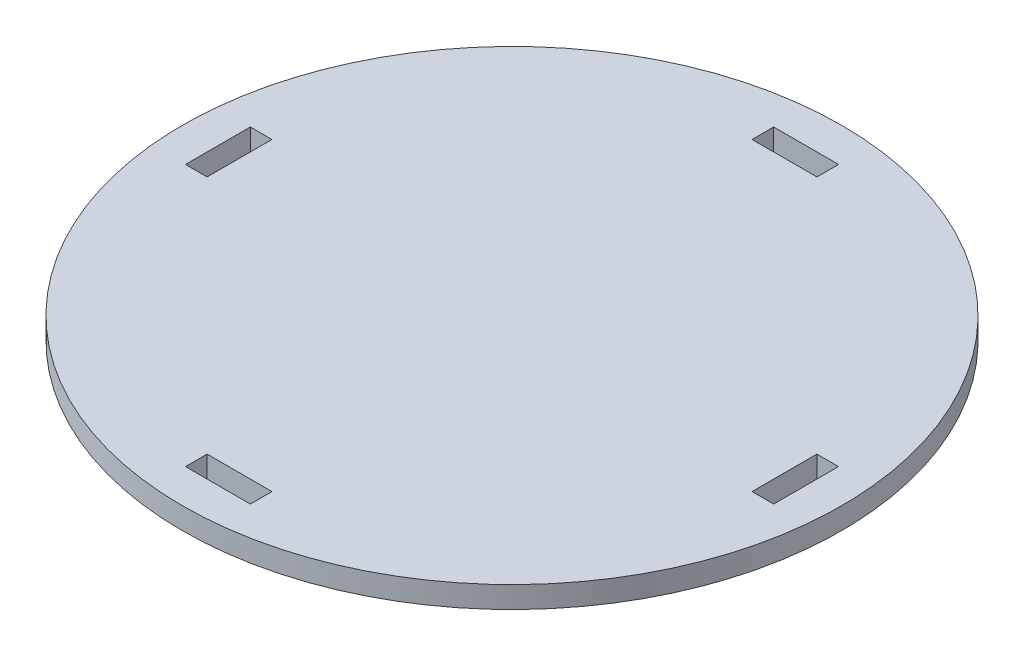
ISO-10303-21;
HEADER;
FILE_DESCRIPTION(('STEP AP214'),'2;1');
FILE_NAME('part.step','',(''),(''),'','','');
FILE_SCHEMA(('AUTOMOTIVE_DESIGN { 1 0 10303 214 1 1 1 1 }'));
ENDSEC;
DATA;
#1=APPLICATION_CONTEXT('core data for automotive mechanical design processes');
#2=APPLICATION_PROTOCOL_DEFINITION('international standard','automotive_design',2000,#1);
#3=PRODUCT_CONTEXT('',#1,'mechanical');
#4=PRODUCT('Part','Part','',(#3));
#5=PRODUCT_RELATED_PRODUCT_CATEGORY('part','',(#4));
#6=PRODUCT_DEFINITION_FORMATION('','',#4);
#7=PRODUCT_DEFINITION_CONTEXT('part definition',#1,'design');
#8=PRODUCT_DEFINITION('design','',#6,#7);
#9=PRODUCT_DEFINITION_SHAPE('','',#8);
#10=(LENGTH_UNIT() NAMED_UNIT(*) SI_UNIT(.MILLI.,.METRE.));
#11=(NAMED_UNIT(*) PLANE_ANGLE_UNIT() SI_UNIT($,.RADIAN.));
#12=(NAMED_UNIT(*) SI_UNIT($,.STERADIAN.) SOLID_ANGLE_UNIT());
#13=UNCERTAINTY_MEASURE_WITH_UNIT(LENGTH_MEASURE(1.E-05),#10,'distance_accuracy_value','');
#14=(GEOMETRIC_REPRESENTATION_CONTEXT(3) GLOBAL_UNCERTAINTY_ASSIGNED_CONTEXT((#13)) GLOBAL_UNIT_ASSIGNED_CONTEXT((#10,
#11,#12)) REPRESENTATION_CONTEXT('',''));
#15=CARTESIAN_POINT('',(0.,0.,0.));
#16=DIRECTION('',(0.,0.,1.));
#17=DIRECTION('',(1.,0.,0.));
#18=AXIS2_PLACEMENT_3D('',#15,#16,#17);
#19=CARTESIAN_POINT('',(0.,5.,0.));
#20=DIRECTION('',(0.,1.,0.));
#21=DIRECTION('',(0.,0.,1.));
#22=AXIS2_PLACEMENT_3D('',#19,#20,#21);
#23=PLANE('',#22);
#24=CARTESIAN_POINT('',(0.,5.,0.));
#25=DIRECTION('',(0.,1.,0.));
#26=DIRECTION('',(0.,0.,1.));
#27=AXIS2_PLACEMENT_3D('',#24,#25,#26);
#28=CIRCLE('',#27,76.2);
#29=CARTESIAN_POINT('',(0.,5.,76.2));
#30=VERTEX_POINT('',#29);
#31=EDGE_CURVE('E11',#30,#30,#28,.T.);
#32=ORIENTED_EDGE('',*,*,#31,.T.);
#33=EDGE_LOOP('',(#32));
#34=FACE_BOUND('',#33,.T.);
#35=DIRECTION('',(-1.,0.,0.));
#36=VECTOR('',#35,1.);
#37=CARTESIAN_POINT('',(-63.,5.,-7.5));
#38=LINE('',#37,#36);
#39=CARTESIAN_POINT('',(-63.,5.,-7.5));
#40=VERTEX_POINT('',#39);
#41=CARTESIAN_POINT('',(-68.,5.,-7.50000000000001));
#42=VERTEX_POINT('',#41);
#43=EDGE_CURVE('E294',#40,#42,#38,.T.);
#44=ORIENTED_EDGE('',*,*,#43,.F.);
#45=DIRECTION('',(0.,0.,-1.));
#46=VECTOR('',#45,1.);
#47=CARTESIAN_POINT('',(-63.,5.,-7.5));
#48=LINE('',#47,#46);
#49=CARTESIAN_POINT('',(-63.,5.,7.5));
#50=VERTEX_POINT('',#49);
#51=EDGE_CURVE('E291',#50,#40,#48,.T.);
#52=ORIENTED_EDGE('',*,*,#51,.F.);
#53=DIRECTION('',(1.,0.,0.));
#54=VECTOR('',#53,1.);
#55=CARTESIAN_POINT('',(-63.,5.,7.5));
#56=LINE('',#55,#54);
#57=CARTESIAN_POINT('',(-68.,5.,7.49999999999999));
#58=VERTEX_POINT('',#57);
#59=EDGE_CURVE('E302',#58,#50,#56,.T.);
#60=ORIENTED_EDGE('',*,*,#59,.F.);
#61=DIRECTION('',(0.,0.,1.));
#62=VECTOR('',#61,1.);
#63=CARTESIAN_POINT('',(-68.,5.,-7.50000000000001));
#64=LINE('',#63,#62);
#65=EDGE_CURVE('E298',#42,#58,#64,.T.);
#66=ORIENTED_EDGE('',*,*,#65,.F.);
#67=EDGE_LOOP('',(#44,#52,#60,#66));
#68=FACE_BOUND('',#67,.T.);
#69=DIRECTION('',(0.,0.,-1.));
#70=VECTOR('',#69,1.);
#71=CARTESIAN_POINT('',(7.49999999999193,5.,-63.0000000000103));
#72=LINE('',#71,#70);
#73=CARTESIAN_POINT('',(7.49999999999193,5.,-63.0000000000103));
#74=VERTEX_POINT('',#73);
#75=CARTESIAN_POINT('',(7.49999999999193,5.,-68.0000000000103));
#76=VERTEX_POINT('',#75);
#77=EDGE_CURVE('E251',#74,#76,#72,.T.);
#78=ORIENTED_EDGE('',*,*,#77,.F.);
#79=DIRECTION('',(1.,0.,0.));
#80=VECTOR('',#79,1.);
#81=CARTESIAN_POINT('',(7.49999999999193,5.,-63.0000000000103));
#82=LINE('',#81,#80);
#83=CARTESIAN_POINT('',(-7.50000000000807,5.,-63.0000000000103));
#84=VERTEX_POINT('',#83);
#85=EDGE_CURVE('E248',#84,#74,#82,.T.);
#86=ORIENTED_EDGE('',*,*,#85,.F.);
#87=DIRECTION('',(0.,0.,1.));
#88=VECTOR('',#87,1.);
#89=CARTESIAN_POINT('',(-7.50000000000807,5.,-63.0000000000103));
#90=LINE('',#89,#88);
#91=CARTESIAN_POINT('',(-7.50000000000807,5.,-68.0000000000103));
#92=VERTEX_POINT('',#91);
#93=EDGE_CURVE('E259',#92,#84,#90,.T.);
#94=ORIENTED_EDGE('',*,*,#93,.F.);
#95=DIRECTION('',(-1.,0.,0.));
#96=VECTOR('',#95,1.);
#97=CARTESIAN_POINT('',(7.49999999999193,5.,-68.0000000000103));
#98=LINE('',#97,#96);
#99=EDGE_CURVE('E255',#76,#92,#98,.T.);
#100=ORIENTED_EDGE('',*,*,#99,.F.);
#101=EDGE_LOOP('',(#78,#86,#94,#100));
#102=FACE_BOUND('',#101,.T.);
#103=DIRECTION('',(1.,0.,0.));
#104=VECTOR('',#103,1.);
#105=CARTESIAN_POINT('',(63.0000000000023,5.,7.49999999998161));
#106=LINE('',#105,#104);
#107=CARTESIAN_POINT('',(63.0000000000023,5.,7.49999999998161));
#108=VERTEX_POINT('',#107);
#109=CARTESIAN_POINT('',(68.0000000000023,5.,7.49999999998161));
#110=VERTEX_POINT('',#109);
#111=EDGE_CURVE('E208',#108,#110,#106,.T.);
#112=ORIENTED_EDGE('',*,*,#111,.F.);
#113=DIRECTION('',(0.,0.,1.));
#114=VECTOR('',#113,1.);
#115=CARTESIAN_POINT('',(63.0000000000023,5.,7.49999999998161));
#116=LINE('',#115,#114);
#117=CARTESIAN_POINT('',(63.0000000000023,5.,-7.50000000001839));
#118=VERTEX_POINT('',#117);
#119=EDGE_CURVE('E205',#118,#108,#116,.T.);
#120=ORIENTED_EDGE('',*,*,#119,.F.);
#121=DIRECTION('',(-1.,0.,0.));
#122=VECTOR('',#121,1.);
#123=CARTESIAN_POINT('',(63.0000000000023,5.,-7.50000000001839));
#124=LINE('',#123,#122);
#125=CARTESIAN_POINT('',(68.0000000000023,5.,-7.50000000001839));
#126=VERTEX_POINT('',#125);
#127=EDGE_CURVE('E216',#126,#118,#124,.T.);
#128=ORIENTED_EDGE('',*,*,#127,.F.);
#129=DIRECTION('',(0.,0.,-1.));
#130=VECTOR('',#129,1.);
#131=CARTESIAN_POINT('',(68.0000000000023,5.,7.49999999998161));
#132=LINE('',#131,#130);
#133=EDGE_CURVE('E212',#110,#126,#132,.T.);
#134=ORIENTED_EDGE('',*,*,#133,.F.);
#135=EDGE_LOOP('',(#112,#120,#128,#134));
#136=FACE_BOUND('',#135,.T.);
#137=DIRECTION('',(0.,0.,1.));
#138=VECTOR('',#137,1.);
#139=CARTESIAN_POINT('',(-7.49999999998967,5.,62.9999999999919));
#140=LINE('',#139,#138);
#141=CARTESIAN_POINT('',(-7.49999999998967,5.,62.9999999999919));
#142=VERTEX_POINT('',#141);
#143=CARTESIAN_POINT('',(-7.49999999998968,5.,67.999999999992));
#144=VERTEX_POINT('',#143);
#145=EDGE_CURVE('E166',#142,#144,#140,.T.);
#146=ORIENTED_EDGE('',*,*,#145,.F.);
#147=DIRECTION('',(-1.,0.,0.));
#148=VECTOR('',#147,1.);
#149=CARTESIAN_POINT('',(-7.49999999998967,5.,62.9999999999919));
#150=LINE('',#149,#148);
#151=CARTESIAN_POINT('',(7.50000000001033,5.,62.9999999999919));
#152=VERTEX_POINT('',#151);
#153=EDGE_CURVE('E157',#152,#142,#150,.T.);
#154=ORIENTED_EDGE('',*,*,#153,.F.);
#155=DIRECTION('',(0.,0.,-1.));
#156=VECTOR('',#155,1.);
#157=CARTESIAN_POINT('',(7.50000000001033,5.,62.9999999999919));
#158=LINE('',#157,#156);
#159=CARTESIAN_POINT('',(7.50000000001032,5.,67.999999999992));
#160=VERTEX_POINT('',#159);
#161=EDGE_CURVE('E183',#160,#152,#158,.T.);
#162=ORIENTED_EDGE('',*,*,#161,.F.);
#163=DIRECTION('',(1.,0.,0.));
#164=VECTOR('',#163,1.);
#165=CARTESIAN_POINT('',(-7.49999999998968,5.,67.999999999992));
#166=LINE('',#165,#164);
#167=EDGE_CURVE('E179',#144,#160,#166,.T.);
#168=ORIENTED_EDGE('',*,*,#167,.F.);
#169=EDGE_LOOP('',(#146,#154,#162,#168));
#170=FACE_BOUND('',#169,.T.);
#171=ADVANCED_FACE('F43',(#34,#68,#102,#136,#170),#23,.T.);
#172=CARTESIAN_POINT('',(0.,0.,0.));
#173=DIRECTION('',(0.,1.,0.));
#174=DIRECTION('',(0.,0.,1.));
#175=AXIS2_PLACEMENT_3D('',#172,#173,#174);
#176=PLANE('',#175);
#177=DIRECTION('',(0.,0.,1.));
#178=VECTOR('',#177,1.);
#179=CARTESIAN_POINT('',(63.0000000000023,0.,7.49999999998161));
#180=LINE('',#179,#178);
#181=CARTESIAN_POINT('',(63.0000000000023,0.,-7.50000000001839));
#182=VERTEX_POINT('',#181);
#183=CARTESIAN_POINT('',(63.0000000000023,0.,7.49999999998161));
#184=VERTEX_POINT('',#183);
#185=EDGE_CURVE('E175',#182,#184,#180,.T.);
#186=ORIENTED_EDGE('',*,*,#185,.T.);
#187=DIRECTION('',(1.,0.,0.));
#188=VECTOR('',#187,1.);
#189=CARTESIAN_POINT('',(63.0000000000023,0.,7.49999999998161));
#190=LINE('',#189,#188);
#191=CARTESIAN_POINT('',(68.0000000000023,0.,7.49999999998161));
#192=VERTEX_POINT('',#191);
#193=EDGE_CURVE('E223',#184,#192,#190,.T.);
#194=ORIENTED_EDGE('',*,*,#193,.T.);
#195=DIRECTION('',(0.,0.,-1.));
#196=VECTOR('',#195,1.);
#197=CARTESIAN_POINT('',(68.0000000000023,0.,7.49999999998161));
#198=LINE('',#197,#196);
#199=CARTESIAN_POINT('',(68.0000000000023,0.,-7.50000000001839));
#200=VERTEX_POINT('',#199);
#201=EDGE_CURVE('E227',#192,#200,#198,.T.);
#202=ORIENTED_EDGE('',*,*,#201,.T.);
#203=DIRECTION('',(-1.,0.,0.));
#204=VECTOR('',#203,1.);
#205=CARTESIAN_POINT('',(63.0000000000023,0.,-7.50000000001839));
#206=LINE('',#205,#204);
#207=EDGE_CURVE('E209',#200,#182,#206,.T.);
#208=ORIENTED_EDGE('',*,*,#207,.T.);
#209=EDGE_LOOP('',(#186,#194,#202,#208));
#210=FACE_BOUND('',#209,.T.);
#211=DIRECTION('',(0.,0.,-1.));
#212=VECTOR('',#211,1.);
#213=CARTESIAN_POINT('',(-63.,0.,-7.5));
#214=LINE('',#213,#212);
#215=CARTESIAN_POINT('',(-63.,0.,7.5));
#216=VERTEX_POINT('',#215);
#217=CARTESIAN_POINT('',(-63.,0.,-7.5));
#218=VERTEX_POINT('',#217);
#219=EDGE_CURVE('E290',#216,#218,#214,.T.);
#220=ORIENTED_EDGE('',*,*,#219,.T.);
#221=DIRECTION('',(-1.,0.,0.));
#222=VECTOR('',#221,1.);
#223=CARTESIAN_POINT('',(-63.,0.,-7.5));
#224=LINE('',#223,#222);
#225=CARTESIAN_POINT('',(-68.,0.,-7.50000000000001));
#226=VERTEX_POINT('',#225);
#227=EDGE_CURVE('E309',#218,#226,#224,.T.);
#228=ORIENTED_EDGE('',*,*,#227,.T.);
#229=DIRECTION('',(0.,0.,1.));
#230=VECTOR('',#229,1.);
#231=CARTESIAN_POINT('',(-68.,0.,-7.50000000000001));
#232=LINE('',#231,#230);
#233=CARTESIAN_POINT('',(-68.,0.,7.49999999999999));
#234=VERTEX_POINT('',#233);
#235=EDGE_CURVE('E313',#226,#234,#232,.T.);
#236=ORIENTED_EDGE('',*,*,#235,.T.);
#237=DIRECTION('',(1.,0.,0.));
#238=VECTOR('',#237,1.);
#239=CARTESIAN_POINT('',(-63.,0.,7.5));
#240=LINE('',#239,#238);
#241=EDGE_CURVE('E295',#234,#216,#240,.T.);
#242=ORIENTED_EDGE('',*,*,#241,.T.);
#243=EDGE_LOOP('',(#220,#228,#236,#242));
#244=FACE_BOUND('',#243,.T.);
#245=CARTESIAN_POINT('',(0.,0.,0.));
#246=DIRECTION('',(0.,1.,0.));
#247=DIRECTION('',(0.,0.,1.));
#248=AXIS2_PLACEMENT_3D('',#245,#246,#247);
#249=CIRCLE('',#248,76.2);
#250=CARTESIAN_POINT('',(0.,0.,76.2));
#251=VERTEX_POINT('',#250);
#252=EDGE_CURVE('E47',#251,#251,#249,.T.);
#253=ORIENTED_EDGE('',*,*,#252,.F.);
#254=EDGE_LOOP('',(#253));
#255=FACE_BOUND('',#254,.T.);
#256=DIRECTION('',(1.,0.,0.));
#257=VECTOR('',#256,1.);
#258=CARTESIAN_POINT('',(7.49999999999193,0.,-63.0000000000103));
#259=LINE('',#258,#257);
#260=CARTESIAN_POINT('',(-7.50000000000807,0.,-63.0000000000103));
#261=VERTEX_POINT('',#260);
#262=CARTESIAN_POINT('',(7.49999999999193,0.,-63.0000000000103));
#263=VERTEX_POINT('',#262);
#264=EDGE_CURVE('E247',#261,#263,#259,.T.);
#265=ORIENTED_EDGE('',*,*,#264,.T.);
#266=DIRECTION('',(0.,0.,-1.));
#267=VECTOR('',#266,1.);
#268=CARTESIAN_POINT('',(7.49999999999193,0.,-63.0000000000103));
#269=LINE('',#268,#267);
#270=CARTESIAN_POINT('',(7.49999999999193,0.,-68.0000000000103));
#271=VERTEX_POINT('',#270);
#272=EDGE_CURVE('E266',#263,#271,#269,.T.);
#273=ORIENTED_EDGE('',*,*,#272,.T.);
#274=DIRECTION('',(-1.,0.,0.));
#275=VECTOR('',#274,1.);
#276=CARTESIAN_POINT('',(7.49999999999193,0.,-68.0000000000103));
#277=LINE('',#276,#275);
#278=CARTESIAN_POINT('',(-7.50000000000807,0.,-68.0000000000103));
#279=VERTEX_POINT('',#278);
#280=EDGE_CURVE('E270',#271,#279,#277,.T.);
#281=ORIENTED_EDGE('',*,*,#280,.T.);
#282=DIRECTION('',(0.,0.,1.));
#283=VECTOR('',#282,1.);
#284=CARTESIAN_POINT('',(-7.50000000000807,0.,-63.0000000000103));
#285=LINE('',#284,#283);
#286=EDGE_CURVE('E252',#279,#261,#285,.T.);
#287=ORIENTED_EDGE('',*,*,#286,.T.);
#288=EDGE_LOOP('',(#265,#273,#281,#287));
#289=FACE_BOUND('',#288,.T.);
#290=DIRECTION('',(-1.,0.,0.));
#291=VECTOR('',#290,1.);
#292=CARTESIAN_POINT('',(-7.49999999998967,0.,62.9999999999919));
#293=LINE('',#292,#291);
#294=CARTESIAN_POINT('',(7.50000000001033,0.,62.9999999999919));
#295=VERTEX_POINT('',#294);
#296=CARTESIAN_POINT('',(-7.49999999998967,0.,62.9999999999919));
#297=VERTEX_POINT('',#296);
#298=EDGE_CURVE('E67',#295,#297,#293,.T.);
#299=ORIENTED_EDGE('',*,*,#298,.T.);
#300=DIRECTION('',(0.,0.,1.));
#301=VECTOR('',#300,1.);
#302=CARTESIAN_POINT('',(-7.49999999998967,0.,62.9999999999919));
#303=LINE('',#302,#301);
#304=CARTESIAN_POINT('',(-7.49999999998968,0.,67.999999999992));
#305=VERTEX_POINT('',#304);
#306=EDGE_CURVE('E173',#297,#305,#303,.T.);
#307=ORIENTED_EDGE('',*,*,#306,.T.);
#308=DIRECTION('',(1.,0.,0.));
#309=VECTOR('',#308,1.);
#310=CARTESIAN_POINT('',(-7.49999999998968,0.,67.999999999992));
#311=LINE('',#310,#309);
#312=CARTESIAN_POINT('',(7.50000000001032,0.,67.999999999992));
#313=VERTEX_POINT('',#312);
#314=EDGE_CURVE('E192',#305,#313,#311,.T.);
#315=ORIENTED_EDGE('',*,*,#314,.T.);
#316=DIRECTION('',(0.,0.,-1.));
#317=VECTOR('',#316,1.);
#318=CARTESIAN_POINT('',(7.50000000001033,0.,62.9999999999919));
#319=LINE('',#318,#317);
#320=EDGE_CURVE('E167',#313,#295,#319,.T.);
#321=ORIENTED_EDGE('',*,*,#320,.T.);
#322=EDGE_LOOP('',(#299,#307,#315,#321));
#323=FACE_BOUND('',#322,.T.);
#324=ADVANCED_FACE('F339',(#210,#244,#255,#289,#323),#176,.F.);
#325=CARTESIAN_POINT('',(0.,5.,0.));
#326=DIRECTION('',(0.,-1.,0.));
#327=DIRECTION('',(0.,0.,-1.));
#328=AXIS2_PLACEMENT_3D('',#325,#326,#327);
#329=CYLINDRICAL_SURFACE('',#328,76.2);
#330=ORIENTED_EDGE('',*,*,#31,.F.);
#331=EDGE_LOOP('',(#330));
#332=FACE_BOUND('',#331,.T.);
#333=ORIENTED_EDGE('',*,*,#252,.T.);
#334=EDGE_LOOP('',(#333));
#335=FACE_BOUND('',#334,.T.);
#336=ADVANCED_FACE('F45',(#332,#335),#329,.T.);
#337=CARTESIAN_POINT('',(-63.,5.,-7.5));
#338=DIRECTION('',(-1.,0.,0.));
#339=DIRECTION('',(0.,0.,1.));
#340=AXIS2_PLACEMENT_3D('',#337,#338,#339);
#341=PLANE('',#340);
#342=ORIENTED_EDGE('',*,*,#219,.F.);
#343=DIRECTION('',(0.,-1.,0.));
#344=VECTOR('',#343,1.);
#345=CARTESIAN_POINT('',(-63.,5.,7.5));
#346=LINE('',#345,#344);
#347=EDGE_CURVE('E305',#50,#216,#346,.T.);
#348=ORIENTED_EDGE('',*,*,#347,.F.);
#349=ORIENTED_EDGE('',*,*,#51,.T.);
#350=DIRECTION('',(0.,-1.,0.));
#351=VECTOR('',#350,1.);
#352=CARTESIAN_POINT('',(-63.,5.,-7.5));
#353=LINE('',#352,#351);
#354=EDGE_CURVE('E329',#40,#218,#353,.T.);
#355=ORIENTED_EDGE('',*,*,#354,.T.);
#356=EDGE_LOOP('',(#342,#348,#349,#355));
#357=FACE_BOUND('',#356,.T.);
#358=ADVANCED_FACE('F361',(#357),#341,.T.);
#359=CARTESIAN_POINT('',(-63.,5.,-7.5));
#360=DIRECTION('',(0.,0.,1.));
#361=DIRECTION('',(1.,0.,0.));
#362=AXIS2_PLACEMENT_3D('',#359,#360,#361);
#363=PLANE('',#362);
#364=ORIENTED_EDGE('',*,*,#227,.F.);
#365=ORIENTED_EDGE('',*,*,#354,.F.);
#366=ORIENTED_EDGE('',*,*,#43,.T.);
#367=DIRECTION('',(0.,-1.,0.));
#368=VECTOR('',#367,1.);
#369=CARTESIAN_POINT('',(-68.,5.,-7.50000000000001));
#370=LINE('',#369,#368);
#371=EDGE_CURVE('E326',#42,#226,#370,.T.);
#372=ORIENTED_EDGE('',*,*,#371,.T.);
#373=EDGE_LOOP('',(#364,#365,#366,#372));
#374=FACE_BOUND('',#373,.T.);
#375=ADVANCED_FACE('F364',(#374),#363,.T.);
#376=CARTESIAN_POINT('',(-68.,5.,-7.50000000000001));
#377=DIRECTION('',(1.,0.,0.));
#378=DIRECTION('',(0.,0.,-1.));
#379=AXIS2_PLACEMENT_3D('',#376,#377,#378);
#380=PLANE('',#379);
#381=ORIENTED_EDGE('',*,*,#235,.F.);
#382=ORIENTED_EDGE('',*,*,#371,.F.);
#383=ORIENTED_EDGE('',*,*,#65,.T.);
#384=DIRECTION('',(0.,-1.,0.));
#385=VECTOR('',#384,1.);
#386=CARTESIAN_POINT('',(-68.,5.,7.49999999999999));
#387=LINE('',#386,#385);
#388=EDGE_CURVE('E323',#58,#234,#387,.T.);
#389=ORIENTED_EDGE('',*,*,#388,.T.);
#390=EDGE_LOOP('',(#381,#382,#383,#389));
#391=FACE_BOUND('',#390,.T.);
#392=ADVANCED_FACE('F367',(#391),#380,.T.);
#393=CARTESIAN_POINT('',(-63.,5.,7.5));
#394=DIRECTION('',(0.,0.,-1.));
#395=DIRECTION('',(-1.,0.,0.));
#396=AXIS2_PLACEMENT_3D('',#393,#394,#395);
#397=PLANE('',#396);
#398=ORIENTED_EDGE('',*,*,#241,.F.);
#399=ORIENTED_EDGE('',*,*,#388,.F.);
#400=ORIENTED_EDGE('',*,*,#59,.T.);
#401=ORIENTED_EDGE('',*,*,#347,.T.);
#402=EDGE_LOOP('',(#398,#399,#400,#401));
#403=FACE_BOUND('',#402,.T.);
#404=ADVANCED_FACE('F371',(#403),#397,.T.);
#405=CARTESIAN_POINT('',(7.49999999999193,5.,-63.0000000000103));
#406=DIRECTION('',(0.,0.,-1.));
#407=DIRECTION('',(-1.,0.,0.));
#408=AXIS2_PLACEMENT_3D('',#405,#406,#407);
#409=PLANE('',#408);
#410=ORIENTED_EDGE('',*,*,#264,.F.);
#411=DIRECTION('',(0.,-1.,0.));
#412=VECTOR('',#411,1.);
#413=CARTESIAN_POINT('',(-7.50000000000807,5.,-63.0000000000103));
#414=LINE('',#413,#412);
#415=EDGE_CURVE('E262',#84,#261,#414,.T.);
#416=ORIENTED_EDGE('',*,*,#415,.F.);
#417=ORIENTED_EDGE('',*,*,#85,.T.);
#418=DIRECTION('',(0.,-1.,0.));
#419=VECTOR('',#418,1.);
#420=CARTESIAN_POINT('',(7.49999999999193,5.,-63.0000000000103));
#421=LINE('',#420,#419);
#422=EDGE_CURVE('E286',#74,#263,#421,.T.);
#423=ORIENTED_EDGE('',*,*,#422,.T.);
#424=EDGE_LOOP('',(#410,#416,#417,#423));
#425=FACE_BOUND('',#424,.T.);
#426=ADVANCED_FACE('F375',(#425),#409,.T.);
#427=CARTESIAN_POINT('',(7.49999999999193,5.,-63.0000000000103));
#428=DIRECTION('',(-1.,0.,0.));
#429=DIRECTION('',(0.,0.,1.));
#430=AXIS2_PLACEMENT_3D('',#427,#428,#429);
#431=PLANE('',#430);
#432=ORIENTED_EDGE('',*,*,#272,.F.);
#433=ORIENTED_EDGE('',*,*,#422,.F.);
#434=ORIENTED_EDGE('',*,*,#77,.T.);
#435=DIRECTION('',(0.,-1.,0.));
#436=VECTOR('',#435,1.);
#437=CARTESIAN_POINT('',(7.49999999999193,5.,-68.0000000000103));
#438=LINE('',#437,#436);
#439=EDGE_CURVE('E283',#76,#271,#438,.T.);
#440=ORIENTED_EDGE('',*,*,#439,.T.);
#441=EDGE_LOOP('',(#432,#433,#434,#440));
#442=FACE_BOUND('',#441,.T.);
#443=ADVANCED_FACE('F379',(#442),#431,.T.);
#444=CARTESIAN_POINT('',(7.49999999999193,5.,-68.0000000000103));
#445=DIRECTION('',(0.,0.,1.));
#446=DIRECTION('',(1.,0.,0.));
#447=AXIS2_PLACEMENT_3D('',#444,#445,#446);
#448=PLANE('',#447);
#449=ORIENTED_EDGE('',*,*,#280,.F.);
#450=ORIENTED_EDGE('',*,*,#439,.F.);
#451=ORIENTED_EDGE('',*,*,#99,.T.);
#452=DIRECTION('',(0.,-1.,0.));
#453=VECTOR('',#452,1.);
#454=CARTESIAN_POINT('',(-7.50000000000807,5.,-68.0000000000103));
#455=LINE('',#454,#453);
#456=EDGE_CURVE('E280',#92,#279,#455,.T.);
#457=ORIENTED_EDGE('',*,*,#456,.T.);
#458=EDGE_LOOP('',(#449,#450,#451,#457));
#459=FACE_BOUND('',#458,.T.);
#460=ADVANCED_FACE('F383',(#459),#448,.T.);
#461=CARTESIAN_POINT('',(-7.50000000000807,5.,-63.0000000000103));
#462=DIRECTION('',(1.,0.,0.));
#463=DIRECTION('',(0.,0.,-1.));
#464=AXIS2_PLACEMENT_3D('',#461,#462,#463);
#465=PLANE('',#464);
#466=ORIENTED_EDGE('',*,*,#286,.F.);
#467=ORIENTED_EDGE('',*,*,#456,.F.);
#468=ORIENTED_EDGE('',*,*,#93,.T.);
#469=ORIENTED_EDGE('',*,*,#415,.T.);
#470=EDGE_LOOP('',(#466,#467,#468,#469));
#471=FACE_BOUND('',#470,.T.);
#472=ADVANCED_FACE('F387',(#471),#465,.T.);
#473=CARTESIAN_POINT('',(63.0000000000023,5.,7.49999999998161));
#474=DIRECTION('',(1.,0.,0.));
#475=DIRECTION('',(0.,0.,-1.));
#476=AXIS2_PLACEMENT_3D('',#473,#474,#475);
#477=PLANE('',#476);
#478=ORIENTED_EDGE('',*,*,#185,.F.);
#479=DIRECTION('',(0.,-1.,0.));
#480=VECTOR('',#479,1.);
#481=CARTESIAN_POINT('',(63.0000000000023,5.,-7.50000000001839));
#482=LINE('',#481,#480);
#483=EDGE_CURVE('E219',#118,#182,#482,.T.);
#484=ORIENTED_EDGE('',*,*,#483,.F.);
#485=ORIENTED_EDGE('',*,*,#119,.T.);
#486=DIRECTION('',(0.,-1.,0.));
#487=VECTOR('',#486,1.);
#488=CARTESIAN_POINT('',(63.0000000000023,5.,7.49999999998161));
#489=LINE('',#488,#487);
#490=EDGE_CURVE('E243',#108,#184,#489,.T.);
#491=ORIENTED_EDGE('',*,*,#490,.T.);
#492=EDGE_LOOP('',(#478,#484,#485,#491));
#493=FACE_BOUND('',#492,.T.);
#494=ADVANCED_FACE('F391',(#493),#477,.T.);
#495=CARTESIAN_POINT('',(63.0000000000023,5.,7.49999999998161));
#496=DIRECTION('',(0.,0.,-1.));
#497=DIRECTION('',(-1.,0.,0.));
#498=AXIS2_PLACEMENT_3D('',#495,#496,#497);
#499=PLANE('',#498);
#500=ORIENTED_EDGE('',*,*,#193,.F.);
#501=ORIENTED_EDGE('',*,*,#490,.F.);
#502=ORIENTED_EDGE('',*,*,#111,.T.);
#503=DIRECTION('',(0.,-1.,0.));
#504=VECTOR('',#503,1.);
#505=CARTESIAN_POINT('',(68.0000000000023,5.,7.49999999998161));
#506=LINE('',#505,#504);
#507=EDGE_CURVE('E240',#110,#192,#506,.T.);
#508=ORIENTED_EDGE('',*,*,#507,.T.);
#509=EDGE_LOOP('',(#500,#501,#502,#508));
#510=FACE_BOUND('',#509,.T.);
#511=ADVANCED_FACE('F395',(#510),#499,.T.);
#512=CARTESIAN_POINT('',(68.0000000000023,5.,7.49999999998161));
#513=DIRECTION('',(-1.,0.,0.));
#514=DIRECTION('',(0.,0.,1.));
#515=AXIS2_PLACEMENT_3D('',#512,#513,#514);
#516=PLANE('',#515);
#517=ORIENTED_EDGE('',*,*,#201,.F.);
#518=ORIENTED_EDGE('',*,*,#507,.F.);
#519=ORIENTED_EDGE('',*,*,#133,.T.);
#520=DIRECTION('',(0.,-1.,0.));
#521=VECTOR('',#520,1.);
#522=CARTESIAN_POINT('',(68.0000000000023,5.,-7.50000000001839));
#523=LINE('',#522,#521);
#524=EDGE_CURVE('E237',#126,#200,#523,.T.);
#525=ORIENTED_EDGE('',*,*,#524,.T.);
#526=EDGE_LOOP('',(#517,#518,#519,#525));
#527=FACE_BOUND('',#526,.T.);
#528=ADVANCED_FACE('F399',(#527),#516,.T.);
#529=CARTESIAN_POINT('',(63.0000000000023,5.,-7.50000000001839));
#530=DIRECTION('',(0.,0.,1.));
#531=DIRECTION('',(1.,0.,0.));
#532=AXIS2_PLACEMENT_3D('',#529,#530,#531);
#533=PLANE('',#532);
#534=ORIENTED_EDGE('',*,*,#207,.F.);
#535=ORIENTED_EDGE('',*,*,#524,.F.);
#536=ORIENTED_EDGE('',*,*,#127,.T.);
#537=ORIENTED_EDGE('',*,*,#483,.T.);
#538=EDGE_LOOP('',(#534,#535,#536,#537));
#539=FACE_BOUND('',#538,.T.);
#540=ADVANCED_FACE('F403',(#539),#533,.T.);
#541=CARTESIAN_POINT('',(-7.49999999998967,5.,62.9999999999919));
#542=DIRECTION('',(0.,0.,1.));
#543=DIRECTION('',(1.,0.,0.));
#544=AXIS2_PLACEMENT_3D('',#541,#542,#543);
#545=PLANE('',#544);
#546=ORIENTED_EDGE('',*,*,#298,.F.);
#547=DIRECTION('',(0.,-1.,0.));
#548=VECTOR('',#547,1.);
#549=CARTESIAN_POINT('',(7.50000000001033,5.,62.9999999999919));
#550=LINE('',#549,#548);
#551=EDGE_CURVE('E161',#152,#295,#550,.T.);
#552=ORIENTED_EDGE('',*,*,#551,.F.);
#553=ORIENTED_EDGE('',*,*,#153,.T.);
#554=DIRECTION('',(0.,-1.,0.));
#555=VECTOR('',#554,1.);
#556=CARTESIAN_POINT('',(-7.49999999998967,5.,62.9999999999919));
#557=LINE('',#556,#555);
#558=EDGE_CURVE('E160',#142,#297,#557,.T.);
#559=ORIENTED_EDGE('',*,*,#558,.T.);
#560=EDGE_LOOP('',(#546,#552,#553,#559));
#561=FACE_BOUND('',#560,.T.);
#562=ADVANCED_FACE('F159',(#561),#545,.T.);
#563=CARTESIAN_POINT('',(-7.49999999998967,5.,62.9999999999919));
#564=DIRECTION('',(1.,0.,0.));
#565=DIRECTION('',(0.,0.,-1.));
#566=AXIS2_PLACEMENT_3D('',#563,#564,#565);
#567=PLANE('',#566);
#568=ORIENTED_EDGE('',*,*,#306,.F.);
#569=ORIENTED_EDGE('',*,*,#558,.F.);
#570=ORIENTED_EDGE('',*,*,#145,.T.);
#571=DIRECTION('',(0.,-1.,0.));
#572=VECTOR('',#571,1.);
#573=CARTESIAN_POINT('',(-7.49999999998968,5.,67.999999999992));
#574=LINE('',#573,#572);
#575=EDGE_CURVE('E176',#144,#305,#574,.T.);
#576=ORIENTED_EDGE('',*,*,#575,.T.);
#577=EDGE_LOOP('',(#568,#569,#570,#576));
#578=FACE_BOUND('',#577,.T.);
#579=ADVANCED_FACE('F170',(#578),#567,.T.);
#580=CARTESIAN_POINT('',(-7.49999999998968,5.,67.999999999992));
#581=DIRECTION('',(0.,0.,-1.));
#582=DIRECTION('',(-1.,0.,0.));
#583=AXIS2_PLACEMENT_3D('',#580,#581,#582);
#584=PLANE('',#583);
#585=ORIENTED_EDGE('',*,*,#314,.F.);
#586=ORIENTED_EDGE('',*,*,#575,.F.);
#587=ORIENTED_EDGE('',*,*,#167,.T.);
#588=DIRECTION('',(0.,-1.,0.));
#589=VECTOR('',#588,1.);
#590=CARTESIAN_POINT('',(7.50000000001032,5.,67.999999999992));
#591=LINE('',#590,#589);
#592=EDGE_CURVE('E59',#160,#313,#591,.T.);
#593=ORIENTED_EDGE('',*,*,#592,.T.);
#594=EDGE_LOOP('',(#585,#586,#587,#593));
#595=FACE_BOUND('',#594,.T.);
#596=ADVANCED_FACE('F347',(#595),#584,.T.);
#597=CARTESIAN_POINT('',(7.50000000001033,5.,62.9999999999919));
#598=DIRECTION('',(-1.,0.,0.));
#599=DIRECTION('',(0.,0.,1.));
#600=AXIS2_PLACEMENT_3D('',#597,#598,#599);
#601=PLANE('',#600);
#602=ORIENTED_EDGE('',*,*,#320,.F.);
#603=ORIENTED_EDGE('',*,*,#592,.F.);
#604=ORIENTED_EDGE('',*,*,#161,.T.);
#605=ORIENTED_EDGE('',*,*,#551,.T.);
#606=EDGE_LOOP('',(#602,#603,#604,#605));
#607=FACE_BOUND('',#606,.T.);
#608=ADVANCED_FACE('F345',(#607),#601,.T.);
#609=CLOSED_SHELL('',(#171,#324,#336,#358,#375,#392,#404,#426,#443,#460,#472,#494,#511,#528,
#540,#562,#579,#596,#608));
#610=MANIFOLD_SOLID_BREP('B2',#609);
#611=ADVANCED_BREP_SHAPE_REPRESENTATION('',(#18,#610),#14);
#612=SHAPE_DEFINITION_REPRESENTATION(#9,#611);
ENDSEC;
END-ISO-10303-21;
